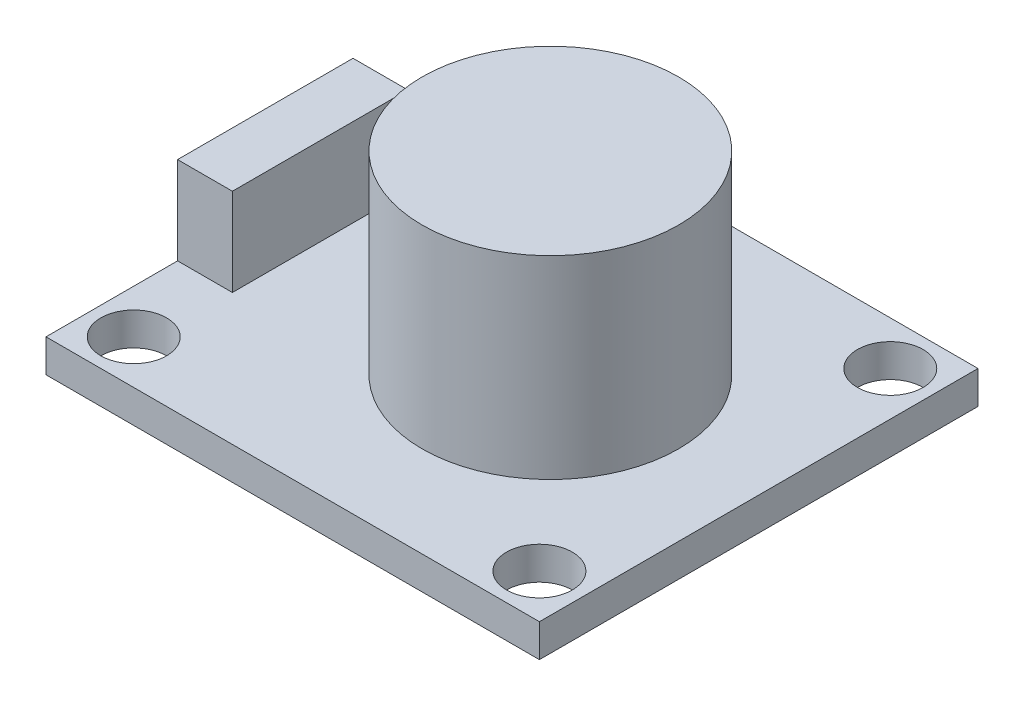
ISO-10303-21;
HEADER;
FILE_DESCRIPTION(('STEP AP214'),'2;1');
FILE_NAME('part.step','',(''),(''),'','','');
FILE_SCHEMA(('AUTOMOTIVE_DESIGN { 1 0 10303 214 1 1 1 1 }'));
ENDSEC;
DATA;
#1=APPLICATION_CONTEXT('core data for automotive mechanical design processes');
#2=APPLICATION_PROTOCOL_DEFINITION('international standard','automotive_design',2000,#1);
#3=PRODUCT_CONTEXT('',#1,'mechanical');
#4=PRODUCT('Part','Part','',(#3));
#5=PRODUCT_RELATED_PRODUCT_CATEGORY('part','',(#4));
#6=PRODUCT_DEFINITION_FORMATION('','',#4);
#7=PRODUCT_DEFINITION_CONTEXT('part definition',#1,'design');
#8=PRODUCT_DEFINITION('design','',#6,#7);
#9=PRODUCT_DEFINITION_SHAPE('','',#8);
#10=(LENGTH_UNIT() NAMED_UNIT(*) SI_UNIT(.MILLI.,.METRE.));
#11=(NAMED_UNIT(*) PLANE_ANGLE_UNIT() SI_UNIT($,.RADIAN.));
#12=(NAMED_UNIT(*) SI_UNIT($,.STERADIAN.) SOLID_ANGLE_UNIT());
#13=UNCERTAINTY_MEASURE_WITH_UNIT(LENGTH_MEASURE(1.E-05),#10,'distance_accuracy_value','');
#14=(GEOMETRIC_REPRESENTATION_CONTEXT(3) GLOBAL_UNCERTAINTY_ASSIGNED_CONTEXT((#13)) GLOBAL_UNIT_ASSIGNED_CONTEXT((#10,
#11,#12)) REPRESENTATION_CONTEXT('',''));
#15=CARTESIAN_POINT('',(0.,0.,0.));
#16=DIRECTION('',(0.,0.,1.));
#17=DIRECTION('',(1.,0.,0.));
#18=AXIS2_PLACEMENT_3D('',#15,#16,#17);
#19=CARTESIAN_POINT('',(0.,-1.5,0.));
#20=DIRECTION('',(1.,0.,0.));
#21=DIRECTION('',(0.,0.,-1.));
#22=AXIS2_PLACEMENT_3D('',#19,#20,#21);
#23=PLANE('',#22);
#24=DIRECTION('',(0.,0.,-1.));
#25=VECTOR('',#24,1.);
#26=CARTESIAN_POINT('',(0.,0.,0.));
#27=LINE('',#26,#25);
#28=CARTESIAN_POINT('',(0.,0.,0.));
#29=VERTEX_POINT('',#28);
#30=CARTESIAN_POINT('',(0.,0.,-6.));
#31=VERTEX_POINT('',#30);
#32=EDGE_CURVE('E248',#29,#31,#27,.T.);
#33=ORIENTED_EDGE('',*,*,#32,.T.);
#34=DIRECTION('',(0.,-1.,0.));
#35=VECTOR('',#34,1.);
#36=CARTESIAN_POINT('',(0.,4.,-6.));
#37=LINE('',#36,#35);
#38=CARTESIAN_POINT('',(0.,4.,-6.));
#39=VERTEX_POINT('',#38);
#40=EDGE_CURVE('E126',#39,#31,#37,.T.);
#41=ORIENTED_EDGE('',*,*,#40,.F.);
#42=DIRECTION('',(0.,0.,-1.));
#43=VECTOR('',#42,1.);
#44=CARTESIAN_POINT('',(0.,4.,0.));
#45=LINE('',#44,#43);
#46=CARTESIAN_POINT('',(0.,4.,-14.));
#47=VERTEX_POINT('',#46);
#48=EDGE_CURVE('E214',#39,#47,#45,.T.);
#49=ORIENTED_EDGE('',*,*,#48,.T.);
#50=DIRECTION('',(0.,-1.,0.));
#51=VECTOR('',#50,1.);
#52=CARTESIAN_POINT('',(0.,4.,-14.));
#53=LINE('',#52,#51);
#54=CARTESIAN_POINT('',(0.,0.,-14.));
#55=VERTEX_POINT('',#54);
#56=EDGE_CURVE('E199',#47,#55,#53,.T.);
#57=ORIENTED_EDGE('',*,*,#56,.T.);
#58=CARTESIAN_POINT('',(0.,0.,-20.));
#59=VERTEX_POINT('',#58);
#60=EDGE_CURVE('E157',#55,#59,#27,.T.);
#61=ORIENTED_EDGE('',*,*,#60,.T.);
#62=DIRECTION('',(0.,1.,0.));
#63=VECTOR('',#62,1.);
#64=CARTESIAN_POINT('',(0.,-1.5,-20.));
#65=LINE('',#64,#63);
#66=CARTESIAN_POINT('',(0.,-1.5,-20.));
#67=VERTEX_POINT('',#66);
#68=EDGE_CURVE('E12',#67,#59,#65,.T.);
#69=ORIENTED_EDGE('',*,*,#68,.F.);
#70=DIRECTION('',(0.,0.,-1.));
#71=VECTOR('',#70,1.);
#72=CARTESIAN_POINT('',(0.,-1.5,0.));
#73=LINE('',#72,#71);
#74=CARTESIAN_POINT('',(0.,-1.5,0.));
#75=VERTEX_POINT('',#74);
#76=EDGE_CURVE('E135',#75,#67,#73,.T.);
#77=ORIENTED_EDGE('',*,*,#76,.F.);
#78=DIRECTION('',(0.,1.,0.));
#79=VECTOR('',#78,1.);
#80=CARTESIAN_POINT('',(0.,-1.5,0.));
#81=LINE('',#80,#79);
#82=EDGE_CURVE('E112',#75,#29,#81,.T.);
#83=ORIENTED_EDGE('',*,*,#82,.T.);
#84=EDGE_LOOP('',(#33,#41,#49,#57,#61,#69,#77,#83));
#85=FACE_BOUND('',#84,.T.);
#86=ADVANCED_FACE('F108',(#85),#23,.F.);
#87=CARTESIAN_POINT('',(0.,-1.5,-20.));
#88=DIRECTION('',(0.,0.,1.));
#89=DIRECTION('',(1.,0.,0.));
#90=AXIS2_PLACEMENT_3D('',#87,#88,#89);
#91=PLANE('',#90);
#92=DIRECTION('',(1.,0.,0.));
#93=VECTOR('',#92,1.);
#94=CARTESIAN_POINT('',(0.,0.,-20.));
#95=LINE('',#94,#93);
#96=CARTESIAN_POINT('',(22.5,0.,-20.));
#97=VERTEX_POINT('',#96);
#98=EDGE_CURVE('E298',#59,#97,#95,.T.);
#99=ORIENTED_EDGE('',*,*,#98,.T.);
#100=DIRECTION('',(0.,1.,0.));
#101=VECTOR('',#100,1.);
#102=CARTESIAN_POINT('',(22.5,-1.5,-20.));
#103=LINE('',#102,#101);
#104=CARTESIAN_POINT('',(22.5,-1.5,-20.));
#105=VERTEX_POINT('',#104);
#106=EDGE_CURVE('E118',#105,#97,#103,.T.);
#107=ORIENTED_EDGE('',*,*,#106,.F.);
#108=DIRECTION('',(1.,0.,0.));
#109=VECTOR('',#108,1.);
#110=CARTESIAN_POINT('',(0.,-1.5,-20.));
#111=LINE('',#110,#109);
#112=EDGE_CURVE('E269',#67,#105,#111,.T.);
#113=ORIENTED_EDGE('',*,*,#112,.F.);
#114=ORIENTED_EDGE('',*,*,#68,.T.);
#115=EDGE_LOOP('',(#99,#107,#113,#114));
#116=FACE_BOUND('',#115,.T.);
#117=ADVANCED_FACE('F315',(#116),#91,.F.);
#118=CARTESIAN_POINT('',(22.5,-1.5,0.));
#119=DIRECTION('',(1.,0.,0.));
#120=DIRECTION('',(0.,0.,-1.));
#121=AXIS2_PLACEMENT_3D('',#118,#119,#120);
#122=PLANE('',#121);
#123=DIRECTION('',(0.,0.,-1.));
#124=VECTOR('',#123,1.);
#125=CARTESIAN_POINT('',(22.5,0.,0.));
#126=LINE('',#125,#124);
#127=CARTESIAN_POINT('',(22.5,0.,0.));
#128=VERTEX_POINT('',#127);
#129=EDGE_CURVE('E294',#128,#97,#126,.T.);
#130=ORIENTED_EDGE('',*,*,#129,.F.);
#131=DIRECTION('',(0.,1.,0.));
#132=VECTOR('',#131,1.);
#133=CARTESIAN_POINT('',(22.5,-1.5,0.));
#134=LINE('',#133,#132);
#135=CARTESIAN_POINT('',(22.5,-1.5,0.));
#136=VERTEX_POINT('',#135);
#137=EDGE_CURVE('E303',#136,#128,#134,.T.);
#138=ORIENTED_EDGE('',*,*,#137,.F.);
#139=DIRECTION('',(0.,0.,-1.));
#140=VECTOR('',#139,1.);
#141=CARTESIAN_POINT('',(22.5,-1.5,0.));
#142=LINE('',#141,#140);
#143=EDGE_CURVE('E265',#136,#105,#142,.T.);
#144=ORIENTED_EDGE('',*,*,#143,.T.);
#145=ORIENTED_EDGE('',*,*,#106,.T.);
#146=EDGE_LOOP('',(#130,#138,#144,#145));
#147=FACE_BOUND('',#146,.T.);
#148=ADVANCED_FACE('F319',(#147),#122,.T.);
#149=CARTESIAN_POINT('',(0.,-1.5,0.));
#150=DIRECTION('',(0.,0.,1.));
#151=DIRECTION('',(1.,0.,0.));
#152=AXIS2_PLACEMENT_3D('',#149,#150,#151);
#153=PLANE('',#152);
#154=DIRECTION('',(1.,0.,0.));
#155=VECTOR('',#154,1.);
#156=CARTESIAN_POINT('',(0.,0.,0.));
#157=LINE('',#156,#155);
#158=EDGE_CURVE('E287',#29,#128,#157,.T.);
#159=ORIENTED_EDGE('',*,*,#158,.F.);
#160=ORIENTED_EDGE('',*,*,#82,.F.);
#161=DIRECTION('',(1.,0.,0.));
#162=VECTOR('',#161,1.);
#163=CARTESIAN_POINT('',(0.,-1.5,0.));
#164=LINE('',#163,#162);
#165=EDGE_CURVE('E262',#75,#136,#164,.T.);
#166=ORIENTED_EDGE('',*,*,#165,.T.);
#167=ORIENTED_EDGE('',*,*,#137,.T.);
#168=EDGE_LOOP('',(#159,#160,#166,#167));
#169=FACE_BOUND('',#168,.T.);
#170=ADVANCED_FACE('F307',(#169),#153,.T.);
#171=CARTESIAN_POINT('',(2.,-1.5,-18.));
#172=DIRECTION('',(0.,1.,0.));
#173=DIRECTION('',(0.,0.,1.));
#174=AXIS2_PLACEMENT_3D('',#171,#172,#173);
#175=CYLINDRICAL_SURFACE('',#174,1.5);
#176=CARTESIAN_POINT('',(2.,-1.5,-18.));
#177=DIRECTION('',(0.,1.,0.));
#178=DIRECTION('',(0.,0.,1.));
#179=AXIS2_PLACEMENT_3D('',#176,#177,#178);
#180=CIRCLE('',#179,1.5);
#181=CARTESIAN_POINT('',(2.,-1.5,-16.5));
#182=VERTEX_POINT('',#181);
#183=EDGE_CURVE('E256',#182,#182,#180,.T.);
#184=ORIENTED_EDGE('',*,*,#183,.F.);
#185=EDGE_LOOP('',(#184));
#186=FACE_BOUND('',#185,.T.);
#187=CARTESIAN_POINT('',(2.,0.,-18.));
#188=DIRECTION('',(0.,1.,0.));
#189=DIRECTION('',(0.,0.,1.));
#190=AXIS2_PLACEMENT_3D('',#187,#188,#189);
#191=CIRCLE('',#190,1.5);
#192=CARTESIAN_POINT('',(2.,0.,-16.5));
#193=VERTEX_POINT('',#192);
#194=EDGE_CURVE('E283',#193,#193,#191,.T.);
#195=ORIENTED_EDGE('',*,*,#194,.T.);
#196=EDGE_LOOP('',(#195));
#197=FACE_BOUND('',#196,.T.);
#198=ADVANCED_FACE('F326',(#186,#197),#175,.F.);
#199=CARTESIAN_POINT('',(2.,-1.5,-2.));
#200=DIRECTION('',(0.,1.,0.));
#201=DIRECTION('',(0.,0.,1.));
#202=AXIS2_PLACEMENT_3D('',#199,#200,#201);
#203=CYLINDRICAL_SURFACE('',#202,1.5);
#204=CARTESIAN_POINT('',(2.,-1.5,-2.));
#205=DIRECTION('',(0.,1.,0.));
#206=DIRECTION('',(0.,0.,1.));
#207=AXIS2_PLACEMENT_3D('',#204,#205,#206);
#208=CIRCLE('',#207,1.5);
#209=CARTESIAN_POINT('',(2.,-1.5,-0.499999999999999));
#210=VERTEX_POINT('',#209);
#211=EDGE_CURVE('E252',#210,#210,#208,.T.);
#212=ORIENTED_EDGE('',*,*,#211,.F.);
#213=EDGE_LOOP('',(#212));
#214=FACE_BOUND('',#213,.T.);
#215=CARTESIAN_POINT('',(2.,0.,-2.));
#216=DIRECTION('',(0.,1.,0.));
#217=DIRECTION('',(0.,0.,1.));
#218=AXIS2_PLACEMENT_3D('',#215,#216,#217);
#219=CIRCLE('',#218,1.5);
#220=CARTESIAN_POINT('',(2.,0.,-0.499999999999999));
#221=VERTEX_POINT('',#220);
#222=EDGE_CURVE('E279',#221,#221,#219,.T.);
#223=ORIENTED_EDGE('',*,*,#222,.T.);
#224=EDGE_LOOP('',(#223));
#225=FACE_BOUND('',#224,.T.);
#226=ADVANCED_FACE('F397',(#214,#225),#203,.F.);
#227=CARTESIAN_POINT('',(20.5,-1.5,-2.));
#228=DIRECTION('',(0.,1.,0.));
#229=DIRECTION('',(0.,0.,1.));
#230=AXIS2_PLACEMENT_3D('',#227,#228,#229);
#231=CYLINDRICAL_SURFACE('',#230,1.5);
#232=CARTESIAN_POINT('',(20.5,-1.5,-2.));
#233=DIRECTION('',(0.,1.,0.));
#234=DIRECTION('',(0.,0.,1.));
#235=AXIS2_PLACEMENT_3D('',#232,#233,#234);
#236=CIRCLE('',#235,1.5);
#237=CARTESIAN_POINT('',(20.5,-1.5,-0.499999999999999));
#238=VERTEX_POINT('',#237);
#239=EDGE_CURVE('E247',#238,#238,#236,.T.);
#240=ORIENTED_EDGE('',*,*,#239,.F.);
#241=EDGE_LOOP('',(#240));
#242=FACE_BOUND('',#241,.T.);
#243=CARTESIAN_POINT('',(20.5,0.,-2.));
#244=DIRECTION('',(0.,1.,0.));
#245=DIRECTION('',(0.,0.,1.));
#246=AXIS2_PLACEMENT_3D('',#243,#244,#245);
#247=CIRCLE('',#246,1.5);
#248=CARTESIAN_POINT('',(20.5,0.,-0.499999999999999));
#249=VERTEX_POINT('',#248);
#250=EDGE_CURVE('E275',#249,#249,#247,.T.);
#251=ORIENTED_EDGE('',*,*,#250,.T.);
#252=EDGE_LOOP('',(#251));
#253=FACE_BOUND('',#252,.T.);
#254=ADVANCED_FACE('F390',(#242,#253),#231,.F.);
#255=CARTESIAN_POINT('',(20.5,-1.5,-18.));
#256=DIRECTION('',(0.,1.,0.));
#257=DIRECTION('',(0.,0.,1.));
#258=AXIS2_PLACEMENT_3D('',#255,#256,#257);
#259=CYLINDRICAL_SURFACE('',#258,1.5);
#260=CARTESIAN_POINT('',(20.5,-1.5,-18.));
#261=DIRECTION('',(0.,1.,0.));
#262=DIRECTION('',(0.,0.,1.));
#263=AXIS2_PLACEMENT_3D('',#260,#261,#262);
#264=CIRCLE('',#263,1.5);
#265=CARTESIAN_POINT('',(20.5,-1.5,-16.5));
#266=VERTEX_POINT('',#265);
#267=EDGE_CURVE('E243',#266,#266,#264,.T.);
#268=ORIENTED_EDGE('',*,*,#267,.F.);
#269=EDGE_LOOP('',(#268));
#270=FACE_BOUND('',#269,.T.);
#271=CARTESIAN_POINT('',(20.5,0.,-18.));
#272=DIRECTION('',(0.,1.,0.));
#273=DIRECTION('',(0.,0.,1.));
#274=AXIS2_PLACEMENT_3D('',#271,#272,#273);
#275=CIRCLE('',#274,1.5);
#276=CARTESIAN_POINT('',(20.5,0.,-16.5));
#277=VERTEX_POINT('',#276);
#278=EDGE_CURVE('E239',#277,#277,#275,.T.);
#279=ORIENTED_EDGE('',*,*,#278,.T.);
#280=EDGE_LOOP('',(#279));
#281=FACE_BOUND('',#280,.T.);
#282=ADVANCED_FACE('F110',(#270,#281),#259,.F.);
#283=CARTESIAN_POINT('',(0.,0.,0.));
#284=DIRECTION('',(0.,1.,0.));
#285=DIRECTION('',(0.,0.,1.));
#286=AXIS2_PLACEMENT_3D('',#283,#284,#285);
#287=PLANE('',#286);
#288=DIRECTION('',(1.,0.,0.));
#289=VECTOR('',#288,1.);
#290=CARTESIAN_POINT('',(0.,0.,-14.));
#291=LINE('',#290,#289);
#292=CARTESIAN_POINT('',(2.5,0.,-14.));
#293=VERTEX_POINT('',#292);
#294=EDGE_CURVE('E224',#55,#293,#291,.T.);
#295=ORIENTED_EDGE('',*,*,#294,.T.);
#296=DIRECTION('',(0.,0.,1.));
#297=VECTOR('',#296,1.);
#298=CARTESIAN_POINT('',(2.5,0.,0.));
#299=LINE('',#298,#297);
#300=CARTESIAN_POINT('',(2.5,0.,-6.));
#301=VERTEX_POINT('',#300);
#302=EDGE_CURVE('E192',#293,#301,#299,.T.);
#303=ORIENTED_EDGE('',*,*,#302,.T.);
#304=DIRECTION('',(1.,0.,0.));
#305=VECTOR('',#304,1.);
#306=CARTESIAN_POINT('',(0.,0.,-6.));
#307=LINE('',#306,#305);
#308=EDGE_CURVE('E210',#31,#301,#307,.T.);
#309=ORIENTED_EDGE('',*,*,#308,.F.);
#310=ORIENTED_EDGE('',*,*,#32,.F.);
#311=ORIENTED_EDGE('',*,*,#158,.T.);
#312=ORIENTED_EDGE('',*,*,#129,.T.);
#313=ORIENTED_EDGE('',*,*,#98,.F.);
#314=ORIENTED_EDGE('',*,*,#60,.F.);
#315=EDGE_LOOP('',(#295,#303,#309,#310,#311,#312,#313,#314));
#316=FACE_BOUND('',#315,.T.);
#317=CARTESIAN_POINT('',(13.,0.,-10.));
#318=DIRECTION('',(0.,1.,0.));
#319=DIRECTION('',(0.,0.,1.));
#320=AXIS2_PLACEMENT_3D('',#317,#318,#319);
#321=CIRCLE('',#320,5.85);
#322=CARTESIAN_POINT('',(13.,0.,-4.15));
#323=VERTEX_POINT('',#322);
#324=EDGE_CURVE('E198',#323,#323,#321,.T.);
#325=ORIENTED_EDGE('',*,*,#324,.F.);
#326=EDGE_LOOP('',(#325));
#327=FACE_BOUND('',#326,.T.);
#328=ORIENTED_EDGE('',*,*,#278,.F.);
#329=EDGE_LOOP('',(#328));
#330=FACE_BOUND('',#329,.T.);
#331=ORIENTED_EDGE('',*,*,#250,.F.);
#332=EDGE_LOOP('',(#331));
#333=FACE_BOUND('',#332,.T.);
#334=ORIENTED_EDGE('',*,*,#222,.F.);
#335=EDGE_LOOP('',(#334));
#336=FACE_BOUND('',#335,.T.);
#337=ORIENTED_EDGE('',*,*,#194,.F.);
#338=EDGE_LOOP('',(#337));
#339=FACE_BOUND('',#338,.T.);
#340=ADVANCED_FACE('F309',(#316,#327,#330,#333,#336,#339),#287,.T.);
#341=CARTESIAN_POINT('',(0.,-1.5,0.));
#342=DIRECTION('',(0.,1.,0.));
#343=DIRECTION('',(0.,0.,1.));
#344=AXIS2_PLACEMENT_3D('',#341,#342,#343);
#345=PLANE('',#344);
#346=ORIENTED_EDGE('',*,*,#267,.T.);
#347=EDGE_LOOP('',(#346));
#348=FACE_BOUND('',#347,.T.);
#349=ORIENTED_EDGE('',*,*,#239,.T.);
#350=EDGE_LOOP('',(#349));
#351=FACE_BOUND('',#350,.T.);
#352=ORIENTED_EDGE('',*,*,#211,.T.);
#353=EDGE_LOOP('',(#352));
#354=FACE_BOUND('',#353,.T.);
#355=ORIENTED_EDGE('',*,*,#183,.T.);
#356=EDGE_LOOP('',(#355));
#357=FACE_BOUND('',#356,.T.);
#358=ORIENTED_EDGE('',*,*,#76,.T.);
#359=ORIENTED_EDGE('',*,*,#112,.T.);
#360=ORIENTED_EDGE('',*,*,#143,.F.);
#361=ORIENTED_EDGE('',*,*,#165,.F.);
#362=EDGE_LOOP('',(#358,#359,#360,#361));
#363=FACE_BOUND('',#362,.T.);
#364=ADVANCED_FACE('F317',(#348,#351,#354,#357,#363),#345,.F.);
#365=CARTESIAN_POINT('',(13.,8.84,-10.));
#366=DIRECTION('',(0.,-1.,0.));
#367=DIRECTION('',(0.,0.,-1.));
#368=AXIS2_PLACEMENT_3D('',#365,#366,#367);
#369=CYLINDRICAL_SURFACE('',#368,5.85);
#370=CARTESIAN_POINT('',(13.,8.84,-10.));
#371=DIRECTION('',(0.,1.,0.));
#372=DIRECTION('',(0.,0.,1.));
#373=AXIS2_PLACEMENT_3D('',#370,#371,#372);
#374=CIRCLE('',#373,5.85);
#375=CARTESIAN_POINT('',(13.,8.84,-4.15));
#376=VERTEX_POINT('',#375);
#377=EDGE_CURVE('E235',#376,#376,#374,.T.);
#378=ORIENTED_EDGE('',*,*,#377,.F.);
#379=EDGE_LOOP('',(#378));
#380=FACE_BOUND('',#379,.T.);
#381=ORIENTED_EDGE('',*,*,#324,.T.);
#382=EDGE_LOOP('',(#381));
#383=FACE_BOUND('',#382,.T.);
#384=ADVANCED_FACE('F338',(#380,#383),#369,.T.);
#385=CARTESIAN_POINT('',(0.,8.84,0.));
#386=DIRECTION('',(0.,1.,0.));
#387=DIRECTION('',(0.,0.,1.));
#388=AXIS2_PLACEMENT_3D('',#385,#386,#387);
#389=PLANE('',#388);
#390=ORIENTED_EDGE('',*,*,#377,.T.);
#391=EDGE_LOOP('',(#390));
#392=FACE_BOUND('',#391,.T.);
#393=ADVANCED_FACE('F342',(#392),#389,.T.);
#394=CARTESIAN_POINT('',(2.5,4.,0.));
#395=DIRECTION('',(1.,0.,0.));
#396=DIRECTION('',(0.,0.,-1.));
#397=AXIS2_PLACEMENT_3D('',#394,#395,#396);
#398=PLANE('',#397);
#399=ORIENTED_EDGE('',*,*,#302,.F.);
#400=DIRECTION('',(0.,-1.,0.));
#401=VECTOR('',#400,1.);
#402=CARTESIAN_POINT('',(2.5,4.,-14.));
#403=LINE('',#402,#401);
#404=CARTESIAN_POINT('',(2.5,4.,-14.));
#405=VERTEX_POINT('',#404);
#406=EDGE_CURVE('E187',#405,#293,#403,.T.);
#407=ORIENTED_EDGE('',*,*,#406,.F.);
#408=DIRECTION('',(0.,0.,1.));
#409=VECTOR('',#408,1.);
#410=CARTESIAN_POINT('',(2.5,4.,0.));
#411=LINE('',#410,#409);
#412=CARTESIAN_POINT('',(2.5,4.,-6.));
#413=VERTEX_POINT('',#412);
#414=EDGE_CURVE('E190',#405,#413,#411,.T.);
#415=ORIENTED_EDGE('',*,*,#414,.T.);
#416=DIRECTION('',(0.,-1.,0.));
#417=VECTOR('',#416,1.);
#418=CARTESIAN_POINT('',(2.5,4.,-6.));
#419=LINE('',#418,#417);
#420=EDGE_CURVE('E221',#413,#301,#419,.T.);
#421=ORIENTED_EDGE('',*,*,#420,.T.);
#422=EDGE_LOOP('',(#399,#407,#415,#421));
#423=FACE_BOUND('',#422,.T.);
#424=ADVANCED_FACE('F189',(#423),#398,.T.);
#425=CARTESIAN_POINT('',(0.,4.,-14.));
#426=DIRECTION('',(0.,0.,-1.));
#427=DIRECTION('',(-1.,0.,0.));
#428=AXIS2_PLACEMENT_3D('',#425,#426,#427);
#429=PLANE('',#428);
#430=ORIENTED_EDGE('',*,*,#294,.F.);
#431=ORIENTED_EDGE('',*,*,#56,.F.);
#432=DIRECTION('',(1.,0.,0.));
#433=VECTOR('',#432,1.);
#434=CARTESIAN_POINT('',(0.,4.,-14.));
#435=LINE('',#434,#433);
#436=EDGE_CURVE('E205',#47,#405,#435,.T.);
#437=ORIENTED_EDGE('',*,*,#436,.T.);
#438=ORIENTED_EDGE('',*,*,#406,.T.);
#439=EDGE_LOOP('',(#430,#431,#437,#438));
#440=FACE_BOUND('',#439,.T.);
#441=ADVANCED_FACE('F212',(#440),#429,.T.);
#442=CARTESIAN_POINT('',(0.,4.,-6.));
#443=DIRECTION('',(0.,0.,-1.));
#444=DIRECTION('',(-1.,0.,0.));
#445=AXIS2_PLACEMENT_3D('',#442,#443,#444);
#446=PLANE('',#445);
#447=ORIENTED_EDGE('',*,*,#308,.T.);
#448=ORIENTED_EDGE('',*,*,#420,.F.);
#449=DIRECTION('',(1.,0.,0.));
#450=VECTOR('',#449,1.);
#451=CARTESIAN_POINT('',(0.,4.,-6.));
#452=LINE('',#451,#450);
#453=EDGE_CURVE('E207',#39,#413,#452,.T.);
#454=ORIENTED_EDGE('',*,*,#453,.F.);
#455=ORIENTED_EDGE('',*,*,#40,.T.);
#456=EDGE_LOOP('',(#447,#448,#454,#455));
#457=FACE_BOUND('',#456,.T.);
#458=ADVANCED_FACE('F311',(#457),#446,.F.);
#459=CARTESIAN_POINT('',(0.,4.,0.));
#460=DIRECTION('',(0.,1.,0.));
#461=DIRECTION('',(0.,0.,1.));
#462=AXIS2_PLACEMENT_3D('',#459,#460,#461);
#463=PLANE('',#462);
#464=ORIENTED_EDGE('',*,*,#414,.F.);
#465=ORIENTED_EDGE('',*,*,#436,.F.);
#466=ORIENTED_EDGE('',*,*,#48,.F.);
#467=ORIENTED_EDGE('',*,*,#453,.T.);
#468=EDGE_LOOP('',(#464,#465,#466,#467));
#469=FACE_BOUND('',#468,.T.);
#470=ADVANCED_FACE('F203',(#469),#463,.T.);
#471=CLOSED_SHELL('',(#86,#117,#148,#170,#198,#226,#254,#282,#340,#364,#384,#393,#424,#441,#458,#470));
#472=MANIFOLD_SOLID_BREP('B2',#471);
#473=ADVANCED_BREP_SHAPE_REPRESENTATION('',(#18,#472),#14);
#474=SHAPE_DEFINITION_REPRESENTATION(#9,#473);
ENDSEC;
END-ISO-10303-21;
